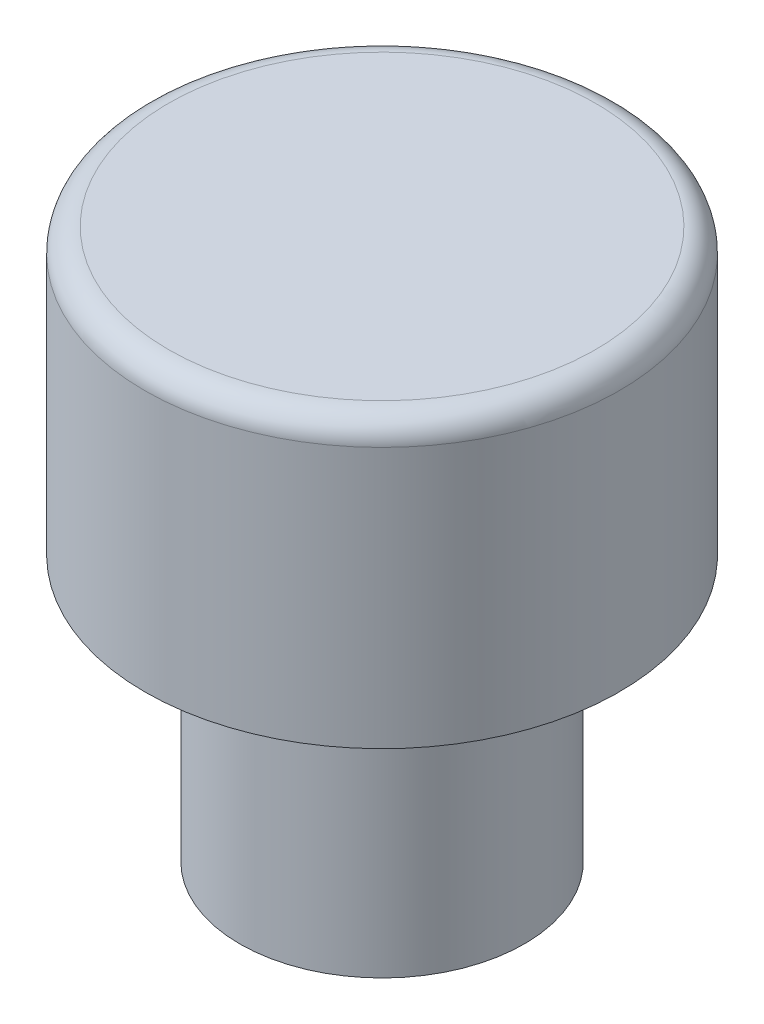
ISO-10303-21;
HEADER;
FILE_DESCRIPTION(('STEP AP214'),'2;1');
FILE_NAME('part.step','',(''),(''),'','','');
FILE_SCHEMA(('AUTOMOTIVE_DESIGN { 1 0 10303 214 1 1 1 1 }'));
ENDSEC;
DATA;
#1=APPLICATION_CONTEXT('core data for automotive mechanical design processes');
#2=APPLICATION_PROTOCOL_DEFINITION('international standard','automotive_design',2000,#1);
#3=PRODUCT_CONTEXT('',#1,'mechanical');
#4=PRODUCT('Part','Part','',(#3));
#5=PRODUCT_RELATED_PRODUCT_CATEGORY('part','',(#4));
#6=PRODUCT_DEFINITION_FORMATION('','',#4);
#7=PRODUCT_DEFINITION_CONTEXT('part definition',#1,'design');
#8=PRODUCT_DEFINITION('design','',#6,#7);
#9=PRODUCT_DEFINITION_SHAPE('','',#8);
#10=(LENGTH_UNIT() NAMED_UNIT(*) SI_UNIT(.MILLI.,.METRE.));
#11=(NAMED_UNIT(*) PLANE_ANGLE_UNIT() SI_UNIT($,.RADIAN.));
#12=(NAMED_UNIT(*) SI_UNIT($,.STERADIAN.) SOLID_ANGLE_UNIT());
#13=UNCERTAINTY_MEASURE_WITH_UNIT(LENGTH_MEASURE(1.E-05),#10,'distance_accuracy_value','');
#14=(GEOMETRIC_REPRESENTATION_CONTEXT(3) GLOBAL_UNCERTAINTY_ASSIGNED_CONTEXT((#13)) GLOBAL_UNIT_ASSIGNED_CONTEXT((#10,
#11,#12)) REPRESENTATION_CONTEXT('',''));
#15=CARTESIAN_POINT('',(0.,0.,0.));
#16=DIRECTION('',(0.,0.,1.));
#17=DIRECTION('',(1.,0.,0.));
#18=AXIS2_PLACEMENT_3D('',#15,#16,#17);
#19=CARTESIAN_POINT('',(0.,0.,0.));
#20=DIRECTION('',(0.,1.,0.));
#21=DIRECTION('',(0.,0.,1.));
#22=AXIS2_PLACEMENT_3D('',#19,#20,#21);
#23=PLANE('',#22);
#24=CARTESIAN_POINT('',(0.,0.,0.));
#25=DIRECTION('',(0.,1.,0.));
#26=DIRECTION('',(0.,0.,1.));
#27=AXIS2_PLACEMENT_3D('',#24,#25,#26);
#28=CIRCLE('',#27,3.);
#29=CARTESIAN_POINT('',(0.,0.,3.));
#30=VERTEX_POINT('',#29);
#31=EDGE_CURVE('E172',#30,#30,#28,.T.);
#32=ORIENTED_EDGE('',*,*,#31,.F.);
#33=EDGE_LOOP('',(#32));
#34=FACE_BOUND('',#33,.T.);
#35=DIRECTION('',(0.,0.,-1.));
#36=VECTOR('',#35,1.);
#37=CARTESIAN_POINT('',(0.584999999999999,0.,-0.885000000000001));
#38=LINE('',#37,#36);
#39=CARTESIAN_POINT('',(0.584999999999999,0.,-0.885000000000001));
#40=VERTEX_POINT('',#39);
#41=CARTESIAN_POINT('',(0.584999999999999,0.,-2.05));
#42=VERTEX_POINT('',#41);
#43=EDGE_CURVE('E48',#40,#42,#38,.T.);
#44=ORIENTED_EDGE('',*,*,#43,.T.);
#45=DIRECTION('',(-1.,0.,0.));
#46=VECTOR('',#45,1.);
#47=CARTESIAN_POINT('',(-0.584999999999999,0.,-2.05));
#48=LINE('',#47,#46);
#49=CARTESIAN_POINT('',(-0.584999999999999,0.,-2.05));
#50=VERTEX_POINT('',#49);
#51=EDGE_CURVE('E284',#42,#50,#48,.T.);
#52=ORIENTED_EDGE('',*,*,#51,.T.);
#53=DIRECTION('',(0.,0.,1.));
#54=VECTOR('',#53,1.);
#55=CARTESIAN_POINT('',(-0.584999999999999,0.,-0.885000000000001));
#56=LINE('',#55,#54);
#57=CARTESIAN_POINT('',(-0.584999999999999,0.,-0.885000000000001));
#58=VERTEX_POINT('',#57);
#59=EDGE_CURVE('E287',#50,#58,#56,.T.);
#60=ORIENTED_EDGE('',*,*,#59,.T.);
#61=CARTESIAN_POINT('',(-0.884999999999999,0.,-0.885000000000001));
#62=DIRECTION('',(0.,-1.,0.));
#63=DIRECTION('',(0.,0.,-1.));
#64=AXIS2_PLACEMENT_3D('',#61,#62,#63);
#65=CIRCLE('',#64,0.3);
#66=CARTESIAN_POINT('',(-0.884999999999999,0.,-0.585000000000001));
#67=VERTEX_POINT('',#66);
#68=EDGE_CURVE('E289',#58,#67,#65,.T.);
#69=ORIENTED_EDGE('',*,*,#68,.T.);
#70=DIRECTION('',(-1.,0.,0.));
#71=VECTOR('',#70,1.);
#72=CARTESIAN_POINT('',(-2.05,0.,-0.584999999999999));
#73=LINE('',#72,#71);
#74=CARTESIAN_POINT('',(-2.05,0.,-0.584999999999999));
#75=VERTEX_POINT('',#74);
#76=EDGE_CURVE('E297',#67,#75,#73,.T.);
#77=ORIENTED_EDGE('',*,*,#76,.T.);
#78=DIRECTION('',(0.,0.,1.));
#79=VECTOR('',#78,1.);
#80=CARTESIAN_POINT('',(-2.05,0.,0.585000000000001));
#81=LINE('',#80,#79);
#82=CARTESIAN_POINT('',(-2.05,0.,0.585000000000001));
#83=VERTEX_POINT('',#82);
#84=EDGE_CURVE('E300',#75,#83,#81,.T.);
#85=ORIENTED_EDGE('',*,*,#84,.T.);
#86=DIRECTION('',(1.,0.,0.));
#87=VECTOR('',#86,1.);
#88=CARTESIAN_POINT('',(-2.05,0.,0.585000000000001));
#89=LINE('',#88,#87);
#90=CARTESIAN_POINT('',(-0.884999999999999,0.,0.585000000000001));
#91=VERTEX_POINT('',#90);
#92=EDGE_CURVE('E303',#83,#91,#89,.T.);
#93=ORIENTED_EDGE('',*,*,#92,.T.);
#94=CARTESIAN_POINT('',(-0.884999999999999,0.,0.885000000000001));
#95=DIRECTION('',(0.,-1.,0.));
#96=DIRECTION('',(0.,0.,1.));
#97=AXIS2_PLACEMENT_3D('',#94,#95,#96);
#98=CIRCLE('',#97,0.3);
#99=CARTESIAN_POINT('',(-0.584999999999999,0.,0.885000000000001));
#100=VERTEX_POINT('',#99);
#101=EDGE_CURVE('E306',#91,#100,#98,.T.);
#102=ORIENTED_EDGE('',*,*,#101,.T.);
#103=DIRECTION('',(0.,0.,1.));
#104=VECTOR('',#103,1.);
#105=CARTESIAN_POINT('',(-0.584999999999999,0.,2.05));
#106=LINE('',#105,#104);
#107=CARTESIAN_POINT('',(-0.584999999999999,0.,2.05));
#108=VERTEX_POINT('',#107);
#109=EDGE_CURVE('E309',#100,#108,#106,.T.);
#110=ORIENTED_EDGE('',*,*,#109,.T.);
#111=DIRECTION('',(1.,0.,0.));
#112=VECTOR('',#111,1.);
#113=CARTESIAN_POINT('',(-0.584999999999999,0.,2.05));
#114=LINE('',#113,#112);
#115=CARTESIAN_POINT('',(0.585,0.,2.05));
#116=VERTEX_POINT('',#115);
#117=EDGE_CURVE('E312',#108,#116,#114,.T.);
#118=ORIENTED_EDGE('',*,*,#117,.T.);
#119=DIRECTION('',(0.,0.,-1.));
#120=VECTOR('',#119,1.);
#121=CARTESIAN_POINT('',(0.585,0.,2.05));
#122=LINE('',#121,#120);
#123=CARTESIAN_POINT('',(0.585,0.,0.885000000000001));
#124=VERTEX_POINT('',#123);
#125=EDGE_CURVE('E315',#116,#124,#122,.T.);
#126=ORIENTED_EDGE('',*,*,#125,.T.);
#127=CARTESIAN_POINT('',(0.884999999999999,0.,0.885000000000001));
#128=DIRECTION('',(0.,-1.,0.));
#129=DIRECTION('',(0.,0.,-1.));
#130=AXIS2_PLACEMENT_3D('',#127,#128,#129);
#131=CIRCLE('',#130,0.3);
#132=CARTESIAN_POINT('',(0.884999999999999,0.,0.585000000000001));
#133=VERTEX_POINT('',#132);
#134=EDGE_CURVE('E137',#124,#133,#131,.T.);
#135=ORIENTED_EDGE('',*,*,#134,.T.);
#136=DIRECTION('',(1.,0.,0.));
#137=VECTOR('',#136,1.);
#138=CARTESIAN_POINT('',(0.884999999999999,0.,0.585000000000001));
#139=LINE('',#138,#137);
#140=CARTESIAN_POINT('',(2.05,0.,0.585000000000001));
#141=VERTEX_POINT('',#140);
#142=EDGE_CURVE('E135',#133,#141,#139,.T.);
#143=ORIENTED_EDGE('',*,*,#142,.T.);
#144=DIRECTION('',(0.,0.,-1.));
#145=VECTOR('',#144,1.);
#146=CARTESIAN_POINT('',(2.05,0.,0.585000000000001));
#147=LINE('',#146,#145);
#148=CARTESIAN_POINT('',(2.05,0.,-0.585000000000002));
#149=VERTEX_POINT('',#148);
#150=EDGE_CURVE('E114',#141,#149,#147,.T.);
#151=ORIENTED_EDGE('',*,*,#150,.T.);
#152=DIRECTION('',(-1.,0.,0.));
#153=VECTOR('',#152,1.);
#154=CARTESIAN_POINT('',(0.884999999999999,0.,-0.585000000000001));
#155=LINE('',#154,#153);
#156=CARTESIAN_POINT('',(0.884999999999999,0.,-0.585000000000001));
#157=VERTEX_POINT('',#156);
#158=EDGE_CURVE('E125',#149,#157,#155,.T.);
#159=ORIENTED_EDGE('',*,*,#158,.T.);
#160=CARTESIAN_POINT('',(0.884999999999999,0.,-0.885000000000001));
#161=DIRECTION('',(0.,-1.,0.));
#162=DIRECTION('',(0.,0.,-1.));
#163=AXIS2_PLACEMENT_3D('',#160,#161,#162);
#164=CIRCLE('',#163,0.3);
#165=EDGE_CURVE('E131',#157,#40,#164,.T.);
#166=ORIENTED_EDGE('',*,*,#165,.T.);
#167=EDGE_LOOP('',(#44,#52,#60,#69,#77,#85,#93,#102,#110,#118,#126,#135,#143,#151,#159,#166));
#168=FACE_BOUND('',#167,.T.);
#169=ADVANCED_FACE('F33',(#34,#168),#23,.F.);
#170=CARTESIAN_POINT('',(0.,5.6,0.));
#171=DIRECTION('',(0.,-1.,0.));
#172=DIRECTION('',(0.,0.,-1.));
#173=AXIS2_PLACEMENT_3D('',#170,#171,#172);
#174=CYLINDRICAL_SURFACE('',#173,3.);
#175=CARTESIAN_POINT('',(0.,5.6,0.));
#176=DIRECTION('',(0.,1.,0.));
#177=DIRECTION('',(0.,0.,1.));
#178=AXIS2_PLACEMENT_3D('',#175,#176,#177);
#179=CIRCLE('',#178,3.);
#180=CARTESIAN_POINT('',(0.,5.6,3.));
#181=VERTEX_POINT('',#180);
#182=EDGE_CURVE('E173',#181,#181,#179,.T.);
#183=ORIENTED_EDGE('',*,*,#182,.F.);
#184=EDGE_LOOP('',(#183));
#185=FACE_BOUND('',#184,.T.);
#186=ORIENTED_EDGE('',*,*,#31,.T.);
#187=EDGE_LOOP('',(#186));
#188=FACE_BOUND('',#187,.T.);
#189=ADVANCED_FACE('F191',(#185,#188),#174,.T.);
#190=CARTESIAN_POINT('',(0.584999999999999,5.6,-0.885000000000001));
#191=DIRECTION('',(-1.,0.,0.));
#192=DIRECTION('',(0.,0.,1.));
#193=AXIS2_PLACEMENT_3D('',#190,#191,#192);
#194=PLANE('',#193);
#195=ORIENTED_EDGE('',*,*,#43,.F.);
#196=DIRECTION('',(0.,-1.,0.));
#197=VECTOR('',#196,1.);
#198=CARTESIAN_POINT('',(0.584999999999999,5.6,-0.885000000000001));
#199=LINE('',#198,#197);
#200=CARTESIAN_POINT('',(0.584999999999999,5.6,-0.885000000000001));
#201=VERTEX_POINT('',#200);
#202=EDGE_CURVE('E143',#201,#40,#199,.T.);
#203=ORIENTED_EDGE('',*,*,#202,.F.);
#204=DIRECTION('',(0.,0.,-1.));
#205=VECTOR('',#204,1.);
#206=CARTESIAN_POINT('',(0.584999999999999,5.6,-0.885000000000001));
#207=LINE('',#206,#205);
#208=CARTESIAN_POINT('',(0.584999999999999,5.6,-2.05));
#209=VERTEX_POINT('',#208);
#210=EDGE_CURVE('E142',#201,#209,#207,.T.);
#211=ORIENTED_EDGE('',*,*,#210,.T.);
#212=DIRECTION('',(0.,-1.,0.));
#213=VECTOR('',#212,1.);
#214=CARTESIAN_POINT('',(0.584999999999999,5.6,-2.05));
#215=LINE('',#214,#213);
#216=EDGE_CURVE('E170',#209,#42,#215,.T.);
#217=ORIENTED_EDGE('',*,*,#216,.T.);
#218=EDGE_LOOP('',(#195,#203,#211,#217));
#219=FACE_BOUND('',#218,.T.);
#220=ADVANCED_FACE('F197',(#219),#194,.T.);
#221=CARTESIAN_POINT('',(-0.584999999999999,5.6,-2.05));
#222=DIRECTION('',(0.,0.,1.));
#223=DIRECTION('',(1.,0.,0.));
#224=AXIS2_PLACEMENT_3D('',#221,#222,#223);
#225=PLANE('',#224);
#226=ORIENTED_EDGE('',*,*,#51,.F.);
#227=ORIENTED_EDGE('',*,*,#216,.F.);
#228=DIRECTION('',(-1.,0.,0.));
#229=VECTOR('',#228,1.);
#230=CARTESIAN_POINT('',(-0.584999999999999,5.6,-2.05));
#231=LINE('',#230,#229);
#232=CARTESIAN_POINT('',(-0.584999999999999,5.6,-2.05));
#233=VERTEX_POINT('',#232);
#234=EDGE_CURVE('E272',#209,#233,#231,.T.);
#235=ORIENTED_EDGE('',*,*,#234,.T.);
#236=DIRECTION('',(0.,-1.,0.));
#237=VECTOR('',#236,1.);
#238=CARTESIAN_POINT('',(-0.584999999999999,5.6,-2.05));
#239=LINE('',#238,#237);
#240=EDGE_CURVE('E168',#233,#50,#239,.T.);
#241=ORIENTED_EDGE('',*,*,#240,.T.);
#242=EDGE_LOOP('',(#226,#227,#235,#241));
#243=FACE_BOUND('',#242,.T.);
#244=ADVANCED_FACE('F203',(#243),#225,.T.);
#245=CARTESIAN_POINT('',(-0.584999999999999,5.6,-0.885000000000001));
#246=DIRECTION('',(1.,0.,0.));
#247=DIRECTION('',(0.,0.,-1.));
#248=AXIS2_PLACEMENT_3D('',#245,#246,#247);
#249=PLANE('',#248);
#250=ORIENTED_EDGE('',*,*,#59,.F.);
#251=ORIENTED_EDGE('',*,*,#240,.F.);
#252=DIRECTION('',(0.,0.,1.));
#253=VECTOR('',#252,1.);
#254=CARTESIAN_POINT('',(-0.584999999999999,5.6,-0.885000000000001));
#255=LINE('',#254,#253);
#256=CARTESIAN_POINT('',(-0.584999999999999,5.6,-0.885000000000001));
#257=VERTEX_POINT('',#256);
#258=EDGE_CURVE('E278',#233,#257,#255,.T.);
#259=ORIENTED_EDGE('',*,*,#258,.T.);
#260=DIRECTION('',(0.,-1.,0.));
#261=VECTOR('',#260,1.);
#262=CARTESIAN_POINT('',(-0.584999999999999,5.6,-0.885000000000001));
#263=LINE('',#262,#261);
#264=EDGE_CURVE('E166',#257,#58,#263,.T.);
#265=ORIENTED_EDGE('',*,*,#264,.T.);
#266=EDGE_LOOP('',(#250,#251,#259,#265));
#267=FACE_BOUND('',#266,.T.);
#268=ADVANCED_FACE('F206',(#267),#249,.T.);
#269=CARTESIAN_POINT('',(-0.884999999999999,5.6,-0.885000000000001));
#270=DIRECTION('',(0.,-1.,0.));
#271=DIRECTION('',(0.,0.,-1.));
#272=AXIS2_PLACEMENT_3D('',#269,#270,#271);
#273=CYLINDRICAL_SURFACE('',#272,0.3);
#274=ORIENTED_EDGE('',*,*,#68,.F.);
#275=ORIENTED_EDGE('',*,*,#264,.F.);
#276=CARTESIAN_POINT('',(-0.884999999999999,5.6,-0.885000000000001));
#277=DIRECTION('',(0.,-1.,0.));
#278=DIRECTION('',(0.,0.,-1.));
#279=AXIS2_PLACEMENT_3D('',#276,#277,#278);
#280=CIRCLE('',#279,0.3);
#281=CARTESIAN_POINT('',(-0.884999999999999,5.6,-0.585000000000001));
#282=VERTEX_POINT('',#281);
#283=EDGE_CURVE('E57',#257,#282,#280,.T.);
#284=ORIENTED_EDGE('',*,*,#283,.T.);
#285=DIRECTION('',(0.,-1.,0.));
#286=VECTOR('',#285,1.);
#287=CARTESIAN_POINT('',(-0.884999999999999,5.6,-0.585000000000001));
#288=LINE('',#287,#286);
#289=EDGE_CURVE('E164',#282,#67,#288,.T.);
#290=ORIENTED_EDGE('',*,*,#289,.T.);
#291=EDGE_LOOP('',(#274,#275,#284,#290));
#292=FACE_BOUND('',#291,.T.);
#293=ADVANCED_FACE('F210',(#292),#273,.T.);
#294=CARTESIAN_POINT('',(-2.05,5.6,-0.584999999999999));
#295=DIRECTION('',(0.,0.,1.));
#296=DIRECTION('',(1.,0.,0.));
#297=AXIS2_PLACEMENT_3D('',#294,#295,#296);
#298=PLANE('',#297);
#299=ORIENTED_EDGE('',*,*,#76,.F.);
#300=ORIENTED_EDGE('',*,*,#289,.F.);
#301=DIRECTION('',(-1.,0.,0.));
#302=VECTOR('',#301,1.);
#303=CARTESIAN_POINT('',(-2.05,5.6,-0.584999999999999));
#304=LINE('',#303,#302);
#305=CARTESIAN_POINT('',(-2.05,5.6,-0.584999999999999));
#306=VERTEX_POINT('',#305);
#307=EDGE_CURVE('E361',#282,#306,#304,.T.);
#308=ORIENTED_EDGE('',*,*,#307,.T.);
#309=DIRECTION('',(0.,-1.,0.));
#310=VECTOR('',#309,1.);
#311=CARTESIAN_POINT('',(-2.05,5.6,-0.584999999999999));
#312=LINE('',#311,#310);
#313=EDGE_CURVE('E162',#306,#75,#312,.T.);
#314=ORIENTED_EDGE('',*,*,#313,.T.);
#315=EDGE_LOOP('',(#299,#300,#308,#314));
#316=FACE_BOUND('',#315,.T.);
#317=ADVANCED_FACE('F214',(#316),#298,.T.);
#318=CARTESIAN_POINT('',(-2.05,5.6,0.585000000000001));
#319=DIRECTION('',(1.,0.,0.));
#320=DIRECTION('',(0.,0.,-1.));
#321=AXIS2_PLACEMENT_3D('',#318,#319,#320);
#322=PLANE('',#321);
#323=ORIENTED_EDGE('',*,*,#84,.F.);
#324=ORIENTED_EDGE('',*,*,#313,.F.);
#325=DIRECTION('',(0.,0.,1.));
#326=VECTOR('',#325,1.);
#327=CARTESIAN_POINT('',(-2.05,5.6,0.585000000000001));
#328=LINE('',#327,#326);
#329=CARTESIAN_POINT('',(-2.05,5.6,0.585000000000001));
#330=VERTEX_POINT('',#329);
#331=EDGE_CURVE('E358',#306,#330,#328,.T.);
#332=ORIENTED_EDGE('',*,*,#331,.T.);
#333=DIRECTION('',(0.,-1.,0.));
#334=VECTOR('',#333,1.);
#335=CARTESIAN_POINT('',(-2.05,5.6,0.585000000000001));
#336=LINE('',#335,#334);
#337=EDGE_CURVE('E160',#330,#83,#336,.T.);
#338=ORIENTED_EDGE('',*,*,#337,.T.);
#339=EDGE_LOOP('',(#323,#324,#332,#338));
#340=FACE_BOUND('',#339,.T.);
#341=ADVANCED_FACE('F218',(#340),#322,.T.);
#342=CARTESIAN_POINT('',(-2.05,5.6,0.585000000000001));
#343=DIRECTION('',(0.,0.,-1.));
#344=DIRECTION('',(-1.,0.,0.));
#345=AXIS2_PLACEMENT_3D('',#342,#343,#344);
#346=PLANE('',#345);
#347=ORIENTED_EDGE('',*,*,#92,.F.);
#348=ORIENTED_EDGE('',*,*,#337,.F.);
#349=DIRECTION('',(1.,0.,0.));
#350=VECTOR('',#349,1.);
#351=CARTESIAN_POINT('',(-2.05,5.6,0.585000000000001));
#352=LINE('',#351,#350);
#353=CARTESIAN_POINT('',(-0.884999999999999,5.6,0.585000000000001));
#354=VERTEX_POINT('',#353);
#355=EDGE_CURVE('E355',#330,#354,#352,.T.);
#356=ORIENTED_EDGE('',*,*,#355,.T.);
#357=DIRECTION('',(0.,-1.,0.));
#358=VECTOR('',#357,1.);
#359=CARTESIAN_POINT('',(-0.884999999999999,5.6,0.585000000000001));
#360=LINE('',#359,#358);
#361=EDGE_CURVE('E158',#354,#91,#360,.T.);
#362=ORIENTED_EDGE('',*,*,#361,.T.);
#363=EDGE_LOOP('',(#347,#348,#356,#362));
#364=FACE_BOUND('',#363,.T.);
#365=ADVANCED_FACE('F222',(#364),#346,.T.);
#366=CARTESIAN_POINT('',(-0.884999999999999,5.6,0.885000000000001));
#367=DIRECTION('',(0.,-1.,0.));
#368=DIRECTION('',(0.,0.,-1.));
#369=AXIS2_PLACEMENT_3D('',#366,#367,#368);
#370=CYLINDRICAL_SURFACE('',#369,0.3);
#371=ORIENTED_EDGE('',*,*,#101,.F.);
#372=ORIENTED_EDGE('',*,*,#361,.F.);
#373=CARTESIAN_POINT('',(-0.884999999999999,5.6,0.885000000000001));
#374=DIRECTION('',(0.,-1.,0.));
#375=DIRECTION('',(0.,0.,1.));
#376=AXIS2_PLACEMENT_3D('',#373,#374,#375);
#377=CIRCLE('',#376,0.3);
#378=CARTESIAN_POINT('',(-0.584999999999999,5.6,0.885000000000001));
#379=VERTEX_POINT('',#378);
#380=EDGE_CURVE('E352',#354,#379,#377,.T.);
#381=ORIENTED_EDGE('',*,*,#380,.T.);
#382=DIRECTION('',(0.,-1.,0.));
#383=VECTOR('',#382,1.);
#384=CARTESIAN_POINT('',(-0.584999999999999,5.6,0.885000000000001));
#385=LINE('',#384,#383);
#386=EDGE_CURVE('E156',#379,#100,#385,.T.);
#387=ORIENTED_EDGE('',*,*,#386,.T.);
#388=EDGE_LOOP('',(#371,#372,#381,#387));
#389=FACE_BOUND('',#388,.T.);
#390=ADVANCED_FACE('F226',(#389),#370,.T.);
#391=CARTESIAN_POINT('',(-0.584999999999999,5.6,2.05));
#392=DIRECTION('',(1.,0.,0.));
#393=DIRECTION('',(0.,0.,-1.));
#394=AXIS2_PLACEMENT_3D('',#391,#392,#393);
#395=PLANE('',#394);
#396=ORIENTED_EDGE('',*,*,#109,.F.);
#397=ORIENTED_EDGE('',*,*,#386,.F.);
#398=DIRECTION('',(0.,0.,1.));
#399=VECTOR('',#398,1.);
#400=CARTESIAN_POINT('',(-0.584999999999999,5.6,2.05));
#401=LINE('',#400,#399);
#402=CARTESIAN_POINT('',(-0.584999999999999,5.6,2.05));
#403=VERTEX_POINT('',#402);
#404=EDGE_CURVE('E349',#379,#403,#401,.T.);
#405=ORIENTED_EDGE('',*,*,#404,.T.);
#406=DIRECTION('',(0.,-1.,0.));
#407=VECTOR('',#406,1.);
#408=CARTESIAN_POINT('',(-0.584999999999999,5.6,2.05));
#409=LINE('',#408,#407);
#410=EDGE_CURVE('E154',#403,#108,#409,.T.);
#411=ORIENTED_EDGE('',*,*,#410,.T.);
#412=EDGE_LOOP('',(#396,#397,#405,#411));
#413=FACE_BOUND('',#412,.T.);
#414=ADVANCED_FACE('F230',(#413),#395,.T.);
#415=CARTESIAN_POINT('',(-0.584999999999999,5.6,2.05));
#416=DIRECTION('',(0.,0.,-1.));
#417=DIRECTION('',(-1.,0.,0.));
#418=AXIS2_PLACEMENT_3D('',#415,#416,#417);
#419=PLANE('',#418);
#420=ORIENTED_EDGE('',*,*,#117,.F.);
#421=ORIENTED_EDGE('',*,*,#410,.F.);
#422=DIRECTION('',(1.,0.,0.));
#423=VECTOR('',#422,1.);
#424=CARTESIAN_POINT('',(-0.584999999999999,5.6,2.05));
#425=LINE('',#424,#423);
#426=CARTESIAN_POINT('',(0.585,5.6,2.05));
#427=VERTEX_POINT('',#426);
#428=EDGE_CURVE('E346',#403,#427,#425,.T.);
#429=ORIENTED_EDGE('',*,*,#428,.T.);
#430=DIRECTION('',(0.,-1.,0.));
#431=VECTOR('',#430,1.);
#432=CARTESIAN_POINT('',(0.585,5.6,2.05));
#433=LINE('',#432,#431);
#434=EDGE_CURVE('E152',#427,#116,#433,.T.);
#435=ORIENTED_EDGE('',*,*,#434,.T.);
#436=EDGE_LOOP('',(#420,#421,#429,#435));
#437=FACE_BOUND('',#436,.T.);
#438=ADVANCED_FACE('F234',(#437),#419,.T.);
#439=CARTESIAN_POINT('',(0.585,5.6,2.05));
#440=DIRECTION('',(-1.,0.,0.));
#441=DIRECTION('',(0.,0.,1.));
#442=AXIS2_PLACEMENT_3D('',#439,#440,#441);
#443=PLANE('',#442);
#444=ORIENTED_EDGE('',*,*,#125,.F.);
#445=ORIENTED_EDGE('',*,*,#434,.F.);
#446=DIRECTION('',(0.,0.,-1.));
#447=VECTOR('',#446,1.);
#448=CARTESIAN_POINT('',(0.585,5.6,2.05));
#449=LINE('',#448,#447);
#450=CARTESIAN_POINT('',(0.585,5.6,0.885000000000001));
#451=VERTEX_POINT('',#450);
#452=EDGE_CURVE('E343',#427,#451,#449,.T.);
#453=ORIENTED_EDGE('',*,*,#452,.T.);
#454=DIRECTION('',(0.,-1.,0.));
#455=VECTOR('',#454,1.);
#456=CARTESIAN_POINT('',(0.585,5.6,0.885000000000001));
#457=LINE('',#456,#455);
#458=EDGE_CURVE('E150',#451,#124,#457,.T.);
#459=ORIENTED_EDGE('',*,*,#458,.T.);
#460=EDGE_LOOP('',(#444,#445,#453,#459));
#461=FACE_BOUND('',#460,.T.);
#462=ADVANCED_FACE('F238',(#461),#443,.T.);
#463=CARTESIAN_POINT('',(0.884999999999999,5.6,0.885000000000001));
#464=DIRECTION('',(0.,-1.,0.));
#465=DIRECTION('',(0.,0.,-1.));
#466=AXIS2_PLACEMENT_3D('',#463,#464,#465);
#467=CYLINDRICAL_SURFACE('',#466,0.3);
#468=ORIENTED_EDGE('',*,*,#134,.F.);
#469=ORIENTED_EDGE('',*,*,#458,.F.);
#470=CARTESIAN_POINT('',(0.884999999999999,5.6,0.885000000000001));
#471=DIRECTION('',(0.,-1.,0.));
#472=DIRECTION('',(0.,0.,-1.));
#473=AXIS2_PLACEMENT_3D('',#470,#471,#472);
#474=CIRCLE('',#473,0.3);
#475=CARTESIAN_POINT('',(0.884999999999999,5.6,0.585000000000001));
#476=VERTEX_POINT('',#475);
#477=EDGE_CURVE('E325',#451,#476,#474,.T.);
#478=ORIENTED_EDGE('',*,*,#477,.T.);
#479=DIRECTION('',(0.,-1.,0.));
#480=VECTOR('',#479,1.);
#481=CARTESIAN_POINT('',(0.884999999999999,5.6,0.585000000000001));
#482=LINE('',#481,#480);
#483=EDGE_CURVE('E148',#476,#133,#482,.T.);
#484=ORIENTED_EDGE('',*,*,#483,.T.);
#485=EDGE_LOOP('',(#468,#469,#478,#484));
#486=FACE_BOUND('',#485,.T.);
#487=ADVANCED_FACE('F242',(#486),#467,.T.);
#488=CARTESIAN_POINT('',(0.884999999999999,5.6,0.585000000000001));
#489=DIRECTION('',(0.,0.,-1.));
#490=DIRECTION('',(-1.,0.,0.));
#491=AXIS2_PLACEMENT_3D('',#488,#489,#490);
#492=PLANE('',#491);
#493=ORIENTED_EDGE('',*,*,#142,.F.);
#494=ORIENTED_EDGE('',*,*,#483,.F.);
#495=DIRECTION('',(1.,0.,0.));
#496=VECTOR('',#495,1.);
#497=CARTESIAN_POINT('',(0.884999999999999,5.6,0.585000000000001));
#498=LINE('',#497,#496);
#499=CARTESIAN_POINT('',(2.05,5.6,0.585000000000001));
#500=VERTEX_POINT('',#499);
#501=EDGE_CURVE('E329',#476,#500,#498,.T.);
#502=ORIENTED_EDGE('',*,*,#501,.T.);
#503=DIRECTION('',(0.,-1.,0.));
#504=VECTOR('',#503,1.);
#505=CARTESIAN_POINT('',(2.05,5.6,0.585000000000001));
#506=LINE('',#505,#504);
#507=EDGE_CURVE('E121',#500,#141,#506,.T.);
#508=ORIENTED_EDGE('',*,*,#507,.T.);
#509=EDGE_LOOP('',(#493,#494,#502,#508));
#510=FACE_BOUND('',#509,.T.);
#511=ADVANCED_FACE('F246',(#510),#492,.T.);
#512=CARTESIAN_POINT('',(2.05,5.6,0.585000000000001));
#513=DIRECTION('',(-1.,0.,0.));
#514=DIRECTION('',(0.,0.,1.));
#515=AXIS2_PLACEMENT_3D('',#512,#513,#514);
#516=PLANE('',#515);
#517=ORIENTED_EDGE('',*,*,#150,.F.);
#518=ORIENTED_EDGE('',*,*,#507,.F.);
#519=DIRECTION('',(0.,0.,-1.));
#520=VECTOR('',#519,1.);
#521=CARTESIAN_POINT('',(2.05,5.6,0.585000000000001));
#522=LINE('',#521,#520);
#523=CARTESIAN_POINT('',(2.05,5.6,-0.585000000000002));
#524=VERTEX_POINT('',#523);
#525=EDGE_CURVE('E118',#500,#524,#522,.T.);
#526=ORIENTED_EDGE('',*,*,#525,.T.);
#527=DIRECTION('',(0.,-1.,0.));
#528=VECTOR('',#527,1.);
#529=CARTESIAN_POINT('',(2.05,5.6,-0.585000000000002));
#530=LINE('',#529,#528);
#531=EDGE_CURVE('E109',#524,#149,#530,.T.);
#532=ORIENTED_EDGE('',*,*,#531,.T.);
#533=EDGE_LOOP('',(#517,#518,#526,#532));
#534=FACE_BOUND('',#533,.T.);
#535=ADVANCED_FACE('F111',(#534),#516,.T.);
#536=CARTESIAN_POINT('',(0.884999999999999,5.6,-0.585000000000001));
#537=DIRECTION('',(0.,0.,1.));
#538=DIRECTION('',(1.,0.,0.));
#539=AXIS2_PLACEMENT_3D('',#536,#537,#538);
#540=PLANE('',#539);
#541=ORIENTED_EDGE('',*,*,#158,.F.);
#542=ORIENTED_EDGE('',*,*,#531,.F.);
#543=DIRECTION('',(-1.,0.,0.));
#544=VECTOR('',#543,1.);
#545=CARTESIAN_POINT('',(0.884999999999999,5.6,-0.585000000000001));
#546=LINE('',#545,#544);
#547=CARTESIAN_POINT('',(0.884999999999999,5.6,-0.585000000000001));
#548=VERTEX_POINT('',#547);
#549=EDGE_CURVE('E337',#524,#548,#546,.T.);
#550=ORIENTED_EDGE('',*,*,#549,.T.);
#551=DIRECTION('',(0.,-1.,0.));
#552=VECTOR('',#551,1.);
#553=CARTESIAN_POINT('',(0.884999999999999,5.6,-0.585000000000001));
#554=LINE('',#553,#552);
#555=EDGE_CURVE('E122',#548,#157,#554,.T.);
#556=ORIENTED_EDGE('',*,*,#555,.T.);
#557=EDGE_LOOP('',(#541,#542,#550,#556));
#558=FACE_BOUND('',#557,.T.);
#559=ADVANCED_FACE('F126',(#558),#540,.T.);
#560=CARTESIAN_POINT('',(0.884999999999999,5.6,-0.885000000000001));
#561=DIRECTION('',(0.,-1.,0.));
#562=DIRECTION('',(0.,0.,-1.));
#563=AXIS2_PLACEMENT_3D('',#560,#561,#562);
#564=CYLINDRICAL_SURFACE('',#563,0.3);
#565=ORIENTED_EDGE('',*,*,#165,.F.);
#566=ORIENTED_EDGE('',*,*,#555,.F.);
#567=CARTESIAN_POINT('',(0.884999999999999,5.6,-0.885000000000001));
#568=DIRECTION('',(0.,-1.,0.));
#569=DIRECTION('',(0.,0.,-1.));
#570=AXIS2_PLACEMENT_3D('',#567,#568,#569);
#571=CIRCLE('',#570,0.3);
#572=EDGE_CURVE('E145',#548,#201,#571,.T.);
#573=ORIENTED_EDGE('',*,*,#572,.T.);
#574=ORIENTED_EDGE('',*,*,#202,.T.);
#575=EDGE_LOOP('',(#565,#566,#573,#574));
#576=FACE_BOUND('',#575,.T.);
#577=ADVANCED_FACE('F255',(#576),#564,.T.);
#578=CARTESIAN_POINT('',(0.,5.6,0.));
#579=DIRECTION('',(0.,1.,0.));
#580=DIRECTION('',(0.,0.,1.));
#581=AXIS2_PLACEMENT_3D('',#578,#579,#580);
#582=PLANE('',#581);
#583=ORIENTED_EDGE('',*,*,#234,.F.);
#584=ORIENTED_EDGE('',*,*,#210,.F.);
#585=ORIENTED_EDGE('',*,*,#572,.F.);
#586=ORIENTED_EDGE('',*,*,#549,.F.);
#587=ORIENTED_EDGE('',*,*,#525,.F.);
#588=ORIENTED_EDGE('',*,*,#501,.F.);
#589=ORIENTED_EDGE('',*,*,#477,.F.);
#590=ORIENTED_EDGE('',*,*,#452,.F.);
#591=ORIENTED_EDGE('',*,*,#428,.F.);
#592=ORIENTED_EDGE('',*,*,#404,.F.);
#593=ORIENTED_EDGE('',*,*,#380,.F.);
#594=ORIENTED_EDGE('',*,*,#355,.F.);
#595=ORIENTED_EDGE('',*,*,#331,.F.);
#596=ORIENTED_EDGE('',*,*,#307,.F.);
#597=ORIENTED_EDGE('',*,*,#283,.F.);
#598=ORIENTED_EDGE('',*,*,#258,.F.);
#599=EDGE_LOOP('',(#583,#584,#585,#586,#587,#588,#589,#590,#591,#592,#593,#594,#595,#596,#597,#598));
#600=FACE_BOUND('',#599,.T.);
#601=ADVANCED_FACE('F258',(#600),#582,.F.);
#602=CARTESIAN_POINT('',(0.,5.6,0.));
#603=DIRECTION('',(0.,1.,0.));
#604=DIRECTION('',(0.,0.,1.));
#605=AXIS2_PLACEMENT_3D('',#602,#603,#604);
#606=CIRCLE('',#605,5.);
#607=CARTESIAN_POINT('',(0.,5.6,5.));
#608=VERTEX_POINT('',#607);
#609=EDGE_CURVE('E291',#608,#608,#606,.T.);
#610=ORIENTED_EDGE('',*,*,#609,.F.);
#611=EDGE_LOOP('',(#610));
#612=FACE_BOUND('',#611,.T.);
#613=ORIENTED_EDGE('',*,*,#182,.T.);
#614=EDGE_LOOP('',(#613));
#615=FACE_BOUND('',#614,.T.);
#616=ADVANCED_FACE('F262',(#612,#615),#582,.F.);
#617=CARTESIAN_POINT('',(0.,11.6,0.));
#618=DIRECTION('',(0.,-1.,0.));
#619=DIRECTION('',(0.,0.,-1.));
#620=AXIS2_PLACEMENT_3D('',#617,#618,#619);
#621=CYLINDRICAL_SURFACE('',#620,5.);
#622=CARTESIAN_POINT('',(0.,11.1,0.));
#623=DIRECTION('',(0.,1.,0.));
#624=DIRECTION('',(0.,0.,1.));
#625=AXIS2_PLACEMENT_3D('',#622,#623,#624);
#626=CIRCLE('',#625,5.);
#627=CARTESIAN_POINT('',(0.,11.1,5.));
#628=VERTEX_POINT('',#627);
#629=EDGE_CURVE('E11',#628,#628,#626,.F.);
#630=ORIENTED_EDGE('',*,*,#629,.T.);
#631=EDGE_LOOP('',(#630));
#632=FACE_BOUND('',#631,.T.);
#633=ORIENTED_EDGE('',*,*,#609,.T.);
#634=EDGE_LOOP('',(#633));
#635=FACE_BOUND('',#634,.T.);
#636=ADVANCED_FACE('F187',(#632,#635),#621,.T.);
#637=CARTESIAN_POINT('',(0.,11.6,0.));
#638=DIRECTION('',(0.,1.,0.));
#639=DIRECTION('',(0.,0.,1.));
#640=AXIS2_PLACEMENT_3D('',#637,#638,#639);
#641=PLANE('',#640);
#642=CARTESIAN_POINT('',(0.,11.6,0.));
#643=DIRECTION('',(0.,1.,0.));
#644=DIRECTION('',(0.,0.,1.));
#645=AXIS2_PLACEMENT_3D('',#642,#643,#644);
#646=CIRCLE('',#645,4.5);
#647=CARTESIAN_POINT('',(0.,11.6,4.5));
#648=VERTEX_POINT('',#647);
#649=EDGE_CURVE('E41',#648,#648,#646,.T.);
#650=ORIENTED_EDGE('',*,*,#649,.T.);
#651=EDGE_LOOP('',(#650));
#652=FACE_BOUND('',#651,.T.);
#653=ADVANCED_FACE('F180',(#652),#641,.T.);
#654=CARTESIAN_POINT('',(0.,11.1,0.));
#655=DIRECTION('',(0.,1.,0.));
#656=DIRECTION('',(0.,0.,1.));
#657=AXIS2_PLACEMENT_3D('',#654,#655,#656);
#658=TOROIDAL_SURFACE('',#657,4.5,0.5);
#659=ORIENTED_EDGE('',*,*,#629,.F.);
#660=EDGE_LOOP('',(#659));
#661=FACE_BOUND('',#660,.T.);
#662=ORIENTED_EDGE('',*,*,#649,.F.);
#663=EDGE_LOOP('',(#662));
#664=FACE_BOUND('',#663,.T.);
#665=ADVANCED_FACE('F35',(#661,#664),#658,.T.);
#666=CLOSED_SHELL('',(#169,#189,#220,#244,#268,#293,#317,#341,#365,#390,#414,#438,#462,#487,
#511,#535,#559,#577,#601,#616,#636,#653,#665));
#667=MANIFOLD_SOLID_BREP('B2',#666);
#668=ADVANCED_BREP_SHAPE_REPRESENTATION('',(#18,#667),#14);
#669=SHAPE_DEFINITION_REPRESENTATION(#9,#668);
ENDSEC;
END-ISO-10303-21;
